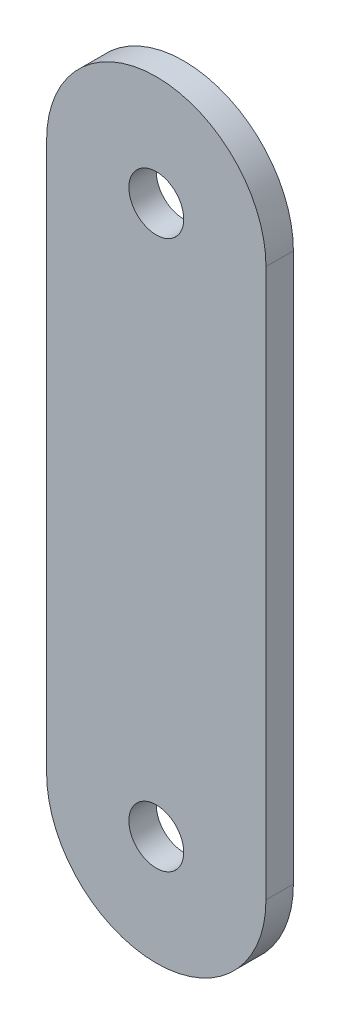
ISO-10303-21;
HEADER;
FILE_DESCRIPTION(('STEP AP214'),'2;1');
FILE_NAME('part.step','',(''),(''),'','','');
FILE_SCHEMA(('AUTOMOTIVE_DESIGN { 1 0 10303 214 1 1 1 1 }'));
ENDSEC;
DATA;
#1=APPLICATION_CONTEXT('core data for automotive mechanical design processes');
#2=APPLICATION_PROTOCOL_DEFINITION('international standard','automotive_design',2000,#1);
#3=PRODUCT_CONTEXT('',#1,'mechanical');
#4=PRODUCT('Part','Part','',(#3));
#5=PRODUCT_RELATED_PRODUCT_CATEGORY('part','',(#4));
#6=PRODUCT_DEFINITION_FORMATION('','',#4);
#7=PRODUCT_DEFINITION_CONTEXT('part definition',#1,'design');
#8=PRODUCT_DEFINITION('design','',#6,#7);
#9=PRODUCT_DEFINITION_SHAPE('','',#8);
#10=(LENGTH_UNIT() NAMED_UNIT(*) SI_UNIT(.MILLI.,.METRE.));
#11=(NAMED_UNIT(*) PLANE_ANGLE_UNIT() SI_UNIT($,.RADIAN.));
#12=(NAMED_UNIT(*) SI_UNIT($,.STERADIAN.) SOLID_ANGLE_UNIT());
#13=UNCERTAINTY_MEASURE_WITH_UNIT(LENGTH_MEASURE(1.E-05),#10,'distance_accuracy_value','');
#14=(GEOMETRIC_REPRESENTATION_CONTEXT(3) GLOBAL_UNCERTAINTY_ASSIGNED_CONTEXT((#13)) GLOBAL_UNIT_ASSIGNED_CONTEXT((#10,
#11,#12)) REPRESENTATION_CONTEXT('',''));
#15=CARTESIAN_POINT('',(0.,0.,0.));
#16=DIRECTION('',(0.,0.,1.));
#17=DIRECTION('',(1.,0.,0.));
#18=AXIS2_PLACEMENT_3D('',#15,#16,#17);
#19=CARTESIAN_POINT('',(0.,-254.,12.7));
#20=DIRECTION('',(0.,0.,1.));
#21=DIRECTION('',(1.,0.,0.));
#22=AXIS2_PLACEMENT_3D('',#19,#20,#21);
#23=PLANE('',#22);
#24=CARTESIAN_POINT('',(0.,0.,12.7));
#25=DIRECTION('',(0.,0.,1.));
#26=DIRECTION('',(1.,0.,0.));
#27=AXIS2_PLACEMENT_3D('',#24,#25,#26);
#28=CIRCLE('',#27,12.7);
#29=CARTESIAN_POINT('',(12.7,0.,12.7));
#30=VERTEX_POINT('',#29);
#31=EDGE_CURVE('E106',#30,#30,#28,.T.);
#32=ORIENTED_EDGE('',*,*,#31,.F.);
#33=EDGE_LOOP('',(#32));
#34=FACE_BOUND('',#33,.T.);
#35=CARTESIAN_POINT('',(0.,-254.,12.7));
#36=DIRECTION('',(0.,0.,1.));
#37=DIRECTION('',(1.,0.,0.));
#38=AXIS2_PLACEMENT_3D('',#35,#36,#37);
#39=CIRCLE('',#38,50.7999999999999);
#40=CARTESIAN_POINT('',(-50.7999999999999,-254.,12.7));
#41=VERTEX_POINT('',#40);
#42=CARTESIAN_POINT('',(50.7999999999999,-254.,12.7));
#43=VERTEX_POINT('',#42);
#44=EDGE_CURVE('E91',#41,#43,#39,.T.);
#45=ORIENTED_EDGE('',*,*,#44,.T.);
#46=DIRECTION('',(0.,1.,0.));
#47=VECTOR('',#46,1.);
#48=CARTESIAN_POINT('',(50.7999999999999,0.,12.7));
#49=LINE('',#48,#47);
#50=CARTESIAN_POINT('',(50.7999999999999,0.,12.7));
#51=VERTEX_POINT('',#50);
#52=EDGE_CURVE('E86',#43,#51,#49,.T.);
#53=ORIENTED_EDGE('',*,*,#52,.T.);
#54=CARTESIAN_POINT('',(0.,0.,12.7));
#55=DIRECTION('',(0.,0.,1.));
#56=DIRECTION('',(1.,0.,0.));
#57=AXIS2_PLACEMENT_3D('',#54,#55,#56);
#58=CIRCLE('',#57,50.7999999999999);
#59=CARTESIAN_POINT('',(-50.7999999999999,0.,12.7));
#60=VERTEX_POINT('',#59);
#61=EDGE_CURVE('E89',#51,#60,#58,.T.);
#62=ORIENTED_EDGE('',*,*,#61,.T.);
#63=DIRECTION('',(0.,-1.,0.));
#64=VECTOR('',#63,1.);
#65=CARTESIAN_POINT('',(-50.7999999999999,-254.,12.7));
#66=LINE('',#65,#64);
#67=EDGE_CURVE('E56',#60,#41,#66,.T.);
#68=ORIENTED_EDGE('',*,*,#67,.T.);
#69=EDGE_LOOP('',(#45,#53,#62,#68));
#70=FACE_BOUND('',#69,.T.);
#71=CARTESIAN_POINT('',(0.,-254.,12.7));
#72=DIRECTION('',(0.,0.,1.));
#73=DIRECTION('',(1.,0.,0.));
#74=AXIS2_PLACEMENT_3D('',#71,#72,#73);
#75=CIRCLE('',#74,12.7);
#76=CARTESIAN_POINT('',(12.7,-254.,12.7));
#77=VERTEX_POINT('',#76);
#78=EDGE_CURVE('E121',#77,#77,#75,.T.);
#79=ORIENTED_EDGE('',*,*,#78,.F.);
#80=EDGE_LOOP('',(#79));
#81=FACE_BOUND('',#80,.T.);
#82=ADVANCED_FACE('F39',(#34,#70,#81),#23,.T.);
#83=CARTESIAN_POINT('',(0.,-254.,0.));
#84=DIRECTION('',(0.,0.,1.));
#85=DIRECTION('',(1.,0.,0.));
#86=AXIS2_PLACEMENT_3D('',#83,#84,#85);
#87=PLANE('',#86);
#88=CARTESIAN_POINT('',(0.,-254.,0.));
#89=DIRECTION('',(0.,0.,1.));
#90=DIRECTION('',(1.,0.,0.));
#91=AXIS2_PLACEMENT_3D('',#88,#89,#90);
#92=CIRCLE('',#91,50.7999999999999);
#93=CARTESIAN_POINT('',(-50.7999999999999,-254.,0.));
#94=VERTEX_POINT('',#93);
#95=CARTESIAN_POINT('',(50.7999999999999,-254.,0.));
#96=VERTEX_POINT('',#95);
#97=EDGE_CURVE('E103',#94,#96,#92,.T.);
#98=ORIENTED_EDGE('',*,*,#97,.F.);
#99=DIRECTION('',(0.,-1.,0.));
#100=VECTOR('',#99,1.);
#101=CARTESIAN_POINT('',(-50.7999999999999,-254.,0.));
#102=LINE('',#101,#100);
#103=CARTESIAN_POINT('',(-50.7999999999999,0.,0.));
#104=VERTEX_POINT('',#103);
#105=EDGE_CURVE('E79',#104,#94,#102,.T.);
#106=ORIENTED_EDGE('',*,*,#105,.F.);
#107=CARTESIAN_POINT('',(0.,0.,0.));
#108=DIRECTION('',(0.,0.,1.));
#109=DIRECTION('',(1.,0.,0.));
#110=AXIS2_PLACEMENT_3D('',#107,#108,#109);
#111=CIRCLE('',#110,50.7999999999999);
#112=CARTESIAN_POINT('',(50.7999999999999,0.,0.));
#113=VERTEX_POINT('',#112);
#114=EDGE_CURVE('E73',#113,#104,#111,.T.);
#115=ORIENTED_EDGE('',*,*,#114,.F.);
#116=DIRECTION('',(0.,1.,0.));
#117=VECTOR('',#116,1.);
#118=CARTESIAN_POINT('',(50.7999999999999,0.,0.));
#119=LINE('',#118,#117);
#120=EDGE_CURVE('E95',#96,#113,#119,.T.);
#121=ORIENTED_EDGE('',*,*,#120,.F.);
#122=EDGE_LOOP('',(#98,#106,#115,#121));
#123=FACE_BOUND('',#122,.T.);
#124=CARTESIAN_POINT('',(0.,0.,0.));
#125=DIRECTION('',(0.,0.,1.));
#126=DIRECTION('',(1.,0.,0.));
#127=AXIS2_PLACEMENT_3D('',#124,#125,#126);
#128=CIRCLE('',#127,12.7);
#129=CARTESIAN_POINT('',(12.7,0.,0.));
#130=VERTEX_POINT('',#129);
#131=EDGE_CURVE('E118',#130,#130,#128,.T.);
#132=ORIENTED_EDGE('',*,*,#131,.T.);
#133=EDGE_LOOP('',(#132));
#134=FACE_BOUND('',#133,.T.);
#135=CARTESIAN_POINT('',(0.,-254.,0.));
#136=DIRECTION('',(0.,0.,1.));
#137=DIRECTION('',(1.,0.,0.));
#138=AXIS2_PLACEMENT_3D('',#135,#136,#137);
#139=CIRCLE('',#138,12.7);
#140=CARTESIAN_POINT('',(12.7,-254.,0.));
#141=VERTEX_POINT('',#140);
#142=EDGE_CURVE('E124',#141,#141,#139,.T.);
#143=ORIENTED_EDGE('',*,*,#142,.T.);
#144=EDGE_LOOP('',(#143));
#145=FACE_BOUND('',#144,.T.);
#146=ADVANCED_FACE('F114',(#123,#134,#145),#87,.F.);
#147=CARTESIAN_POINT('',(0.,-254.,12.7));
#148=DIRECTION('',(0.,0.,-1.));
#149=DIRECTION('',(-1.,0.,0.));
#150=AXIS2_PLACEMENT_3D('',#147,#148,#149);
#151=CYLINDRICAL_SURFACE('',#150,50.7999999999999);
#152=ORIENTED_EDGE('',*,*,#97,.T.);
#153=DIRECTION('',(0.,0.,-1.));
#154=VECTOR('',#153,1.);
#155=CARTESIAN_POINT('',(50.7999999999999,-254.,12.7));
#156=LINE('',#155,#154);
#157=EDGE_CURVE('E11',#43,#96,#156,.T.);
#158=ORIENTED_EDGE('',*,*,#157,.F.);
#159=ORIENTED_EDGE('',*,*,#44,.F.);
#160=DIRECTION('',(0.,0.,-1.));
#161=VECTOR('',#160,1.);
#162=CARTESIAN_POINT('',(-50.7999999999999,-254.,12.7));
#163=LINE('',#162,#161);
#164=EDGE_CURVE('E99',#41,#94,#163,.T.);
#165=ORIENTED_EDGE('',*,*,#164,.T.);
#166=EDGE_LOOP('',(#152,#158,#159,#165));
#167=FACE_BOUND('',#166,.T.);
#168=ADVANCED_FACE('F41',(#167),#151,.T.);
#169=CARTESIAN_POINT('',(50.7999999999999,0.,12.7));
#170=DIRECTION('',(-1.,0.,0.));
#171=DIRECTION('',(0.,-1.,0.));
#172=AXIS2_PLACEMENT_3D('',#169,#170,#171);
#173=PLANE('',#172);
#174=ORIENTED_EDGE('',*,*,#120,.T.);
#175=DIRECTION('',(0.,0.,-1.));
#176=VECTOR('',#175,1.);
#177=CARTESIAN_POINT('',(50.7999999999999,0.,12.7));
#178=LINE('',#177,#176);
#179=EDGE_CURVE('E48',#51,#113,#178,.T.);
#180=ORIENTED_EDGE('',*,*,#179,.F.);
#181=ORIENTED_EDGE('',*,*,#52,.F.);
#182=ORIENTED_EDGE('',*,*,#157,.T.);
#183=EDGE_LOOP('',(#174,#180,#181,#182));
#184=FACE_BOUND('',#183,.T.);
#185=ADVANCED_FACE('F94',(#184),#173,.F.);
#186=CARTESIAN_POINT('',(0.,0.,12.7));
#187=DIRECTION('',(0.,0.,-1.));
#188=DIRECTION('',(-1.,0.,0.));
#189=AXIS2_PLACEMENT_3D('',#186,#187,#188);
#190=CYLINDRICAL_SURFACE('',#189,50.7999999999999);
#191=ORIENTED_EDGE('',*,*,#114,.T.);
#192=DIRECTION('',(0.,0.,-1.));
#193=VECTOR('',#192,1.);
#194=CARTESIAN_POINT('',(-50.7999999999999,0.,12.7));
#195=LINE('',#194,#193);
#196=EDGE_CURVE('E96',#60,#104,#195,.T.);
#197=ORIENTED_EDGE('',*,*,#196,.F.);
#198=ORIENTED_EDGE('',*,*,#61,.F.);
#199=ORIENTED_EDGE('',*,*,#179,.T.);
#200=EDGE_LOOP('',(#191,#197,#198,#199));
#201=FACE_BOUND('',#200,.T.);
#202=ADVANCED_FACE('F97',(#201),#190,.T.);
#203=CARTESIAN_POINT('',(-50.7999999999999,-254.,12.7));
#204=DIRECTION('',(1.,0.,0.));
#205=DIRECTION('',(0.,1.,0.));
#206=AXIS2_PLACEMENT_3D('',#203,#204,#205);
#207=PLANE('',#206);
#208=ORIENTED_EDGE('',*,*,#105,.T.);
#209=ORIENTED_EDGE('',*,*,#164,.F.);
#210=ORIENTED_EDGE('',*,*,#67,.F.);
#211=ORIENTED_EDGE('',*,*,#196,.T.);
#212=EDGE_LOOP('',(#208,#209,#210,#211));
#213=FACE_BOUND('',#212,.T.);
#214=ADVANCED_FACE('F111',(#213),#207,.F.);
#215=CARTESIAN_POINT('',(0.,0.,12.7));
#216=DIRECTION('',(0.,0.,-1.));
#217=DIRECTION('',(-1.,0.,0.));
#218=AXIS2_PLACEMENT_3D('',#215,#216,#217);
#219=CYLINDRICAL_SURFACE('',#218,12.7);
#220=ORIENTED_EDGE('',*,*,#31,.T.);
#221=EDGE_LOOP('',(#220));
#222=FACE_BOUND('',#221,.T.);
#223=ORIENTED_EDGE('',*,*,#131,.F.);
#224=EDGE_LOOP('',(#223));
#225=FACE_BOUND('',#224,.T.);
#226=ADVANCED_FACE('F141',(#222,#225),#219,.F.);
#227=CARTESIAN_POINT('',(0.,-254.,12.7));
#228=DIRECTION('',(0.,0.,-1.));
#229=DIRECTION('',(-1.,0.,0.));
#230=AXIS2_PLACEMENT_3D('',#227,#228,#229);
#231=CYLINDRICAL_SURFACE('',#230,12.7);
#232=ORIENTED_EDGE('',*,*,#78,.T.);
#233=EDGE_LOOP('',(#232));
#234=FACE_BOUND('',#233,.T.);
#235=ORIENTED_EDGE('',*,*,#142,.F.);
#236=EDGE_LOOP('',(#235));
#237=FACE_BOUND('',#236,.T.);
#238=ADVANCED_FACE('F130',(#234,#237),#231,.F.);
#239=CLOSED_SHELL('',(#82,#146,#168,#185,#202,#214,#226,#238));
#240=MANIFOLD_SOLID_BREP('B2',#239);
#241=ADVANCED_BREP_SHAPE_REPRESENTATION('',(#18,#240),#14);
#242=SHAPE_DEFINITION_REPRESENTATION(#9,#241);
ENDSEC;
END-ISO-10303-21;
